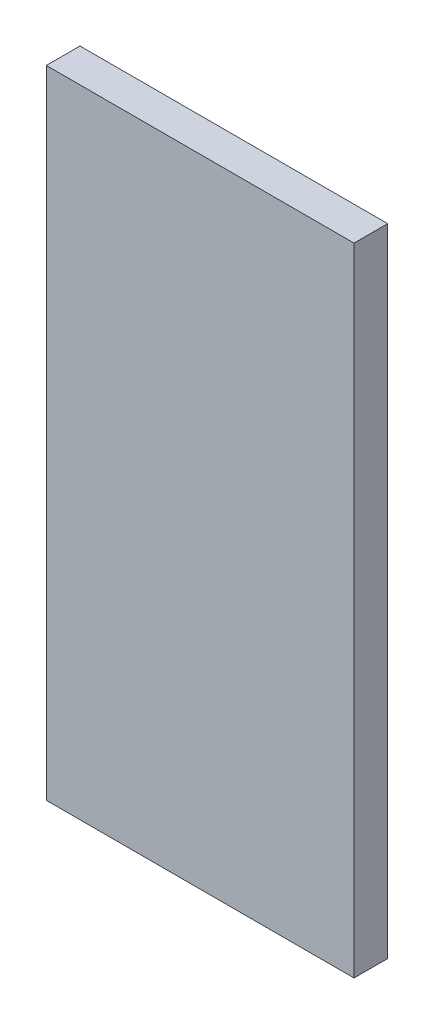
ISO-10303-21;
HEADER;
FILE_DESCRIPTION(('STEP AP214'),'2;1');
FILE_NAME('part.step','',(''),(''),'','','');
FILE_SCHEMA(('AUTOMOTIVE_DESIGN { 1 0 10303 214 1 1 1 1 }'));
ENDSEC;
DATA;
#1=APPLICATION_CONTEXT('core data for automotive mechanical design processes');
#2=APPLICATION_PROTOCOL_DEFINITION('international standard','automotive_design',2000,#1);
#3=PRODUCT_CONTEXT('',#1,'mechanical');
#4=PRODUCT('Part','Part','',(#3));
#5=PRODUCT_RELATED_PRODUCT_CATEGORY('part','',(#4));
#6=PRODUCT_DEFINITION_FORMATION('','',#4);
#7=PRODUCT_DEFINITION_CONTEXT('part definition',#1,'design');
#8=PRODUCT_DEFINITION('design','',#6,#7);
#9=PRODUCT_DEFINITION_SHAPE('','',#8);
#10=(LENGTH_UNIT() NAMED_UNIT(*) SI_UNIT(.MILLI.,.METRE.));
#11=(NAMED_UNIT(*) PLANE_ANGLE_UNIT() SI_UNIT($,.RADIAN.));
#12=(NAMED_UNIT(*) SI_UNIT($,.STERADIAN.) SOLID_ANGLE_UNIT());
#13=UNCERTAINTY_MEASURE_WITH_UNIT(LENGTH_MEASURE(1.E-05),#10,'distance_accuracy_value','');
#14=(GEOMETRIC_REPRESENTATION_CONTEXT(3) GLOBAL_UNCERTAINTY_ASSIGNED_CONTEXT((#13)) GLOBAL_UNIT_ASSIGNED_CONTEXT((#10,
#11,#12)) REPRESENTATION_CONTEXT('',''));
#15=CARTESIAN_POINT('',(0.,0.,0.));
#16=DIRECTION('',(0.,0.,1.));
#17=DIRECTION('',(1.,0.,0.));
#18=AXIS2_PLACEMENT_3D('',#15,#16,#17);
#19=CARTESIAN_POINT('',(42.0476253068543,5.94013447680411,1.7018));
#20=DIRECTION('',(-1.,0.,0.));
#21=DIRECTION('',(0.,0.,1.));
#22=AXIS2_PLACEMENT_3D('',#19,#20,#21);
#23=PLANE('',#22);
#24=DIRECTION('',(0.,1.,0.));
#25=VECTOR('',#24,1.);
#26=CARTESIAN_POINT('',(42.0476253068543,1.21466675355989,1.7018));
#27=LINE('',#26,#25);
#28=CARTESIAN_POINT('',(42.0476253068543,1.21466675355989,1.7018));
#29=VERTEX_POINT('',#28);
#30=CARTESIAN_POINT('',(42.0476253068543,5.94013447680411,1.7018));
#31=VERTEX_POINT('',#30);
#32=EDGE_CURVE('E82',#29,#31,#27,.T.);
#33=ORIENTED_EDGE('',*,*,#32,.F.);
#34=DIRECTION('',(0.,0.,1.));
#35=VECTOR('',#34,1.);
#36=CARTESIAN_POINT('',(42.0476253068543,1.21466675355989,1.7018));
#37=LINE('',#36,#35);
#38=CARTESIAN_POINT('',(42.0476253068543,1.21466675355989,1.9518));
#39=VERTEX_POINT('',#38);
#40=EDGE_CURVE('E71',#29,#39,#37,.T.);
#41=ORIENTED_EDGE('',*,*,#40,.T.);
#42=DIRECTION('',(0.,-1.,0.));
#43=VECTOR('',#42,1.);
#44=CARTESIAN_POINT('',(42.0476253068543,1.21466675355989,1.9518));
#45=LINE('',#44,#43);
#46=CARTESIAN_POINT('',(42.0476253068543,5.94013447680411,1.9518));
#47=VERTEX_POINT('',#46);
#48=EDGE_CURVE('E105',#47,#39,#45,.T.);
#49=ORIENTED_EDGE('',*,*,#48,.F.);
#50=DIRECTION('',(0.,0.,1.));
#51=VECTOR('',#50,1.);
#52=CARTESIAN_POINT('',(42.0476253068543,5.94013447680411,1.7018));
#53=LINE('',#52,#51);
#54=EDGE_CURVE('E11',#31,#47,#53,.T.);
#55=ORIENTED_EDGE('',*,*,#54,.F.);
#56=EDGE_LOOP('',(#33,#41,#49,#55));
#57=FACE_BOUND('',#56,.T.);
#58=ADVANCED_FACE('F16',(#57),#23,.T.);
#59=CARTESIAN_POINT('',(44.33225226396,5.94013447680411,1.7018));
#60=DIRECTION('',(0.,1.,0.));
#61=DIRECTION('',(1.,0.,0.));
#62=AXIS2_PLACEMENT_3D('',#59,#60,#61);
#63=PLANE('',#62);
#64=DIRECTION('',(1.,0.,0.));
#65=VECTOR('',#64,1.);
#66=CARTESIAN_POINT('',(42.0476253068543,5.94013447680411,1.7018));
#67=LINE('',#66,#65);
#68=CARTESIAN_POINT('',(44.33225226396,5.94013447680411,1.7018));
#69=VERTEX_POINT('',#68);
#70=EDGE_CURVE('E86',#31,#69,#67,.T.);
#71=ORIENTED_EDGE('',*,*,#70,.F.);
#72=ORIENTED_EDGE('',*,*,#54,.T.);
#73=DIRECTION('',(-1.,0.,0.));
#74=VECTOR('',#73,1.);
#75=CARTESIAN_POINT('',(42.0476253068543,5.94013447680411,1.9518));
#76=LINE('',#75,#74);
#77=CARTESIAN_POINT('',(44.33225226396,5.94013447680411,1.9518));
#78=VERTEX_POINT('',#77);
#79=EDGE_CURVE('E104',#78,#47,#76,.T.);
#80=ORIENTED_EDGE('',*,*,#79,.F.);
#81=DIRECTION('',(0.,0.,1.));
#82=VECTOR('',#81,1.);
#83=CARTESIAN_POINT('',(44.33225226396,5.94013447680411,1.7018));
#84=LINE('',#83,#82);
#85=EDGE_CURVE('E26',#69,#78,#84,.T.);
#86=ORIENTED_EDGE('',*,*,#85,.F.);
#87=EDGE_LOOP('',(#71,#72,#80,#86));
#88=FACE_BOUND('',#87,.T.);
#89=ADVANCED_FACE('F132',(#88),#63,.T.);
#90=CARTESIAN_POINT('',(44.33225226396,1.21466675355989,1.7018));
#91=DIRECTION('',(1.,0.,0.));
#92=DIRECTION('',(0.,1.,0.));
#93=AXIS2_PLACEMENT_3D('',#90,#91,#92);
#94=PLANE('',#93);
#95=DIRECTION('',(0.,-1.,0.));
#96=VECTOR('',#95,1.);
#97=CARTESIAN_POINT('',(44.33225226396,5.94013447680411,1.7018));
#98=LINE('',#97,#96);
#99=CARTESIAN_POINT('',(44.33225226396,1.21466675355989,1.7018));
#100=VERTEX_POINT('',#99);
#101=EDGE_CURVE('E91',#69,#100,#98,.T.);
#102=ORIENTED_EDGE('',*,*,#101,.F.);
#103=ORIENTED_EDGE('',*,*,#85,.T.);
#104=DIRECTION('',(0.,1.,0.));
#105=VECTOR('',#104,1.);
#106=CARTESIAN_POINT('',(44.33225226396,5.94013447680411,1.9518));
#107=LINE('',#106,#105);
#108=CARTESIAN_POINT('',(44.33225226396,1.21466675355989,1.9518));
#109=VERTEX_POINT('',#108);
#110=EDGE_CURVE('E101',#109,#78,#107,.T.);
#111=ORIENTED_EDGE('',*,*,#110,.F.);
#112=DIRECTION('',(0.,0.,1.));
#113=VECTOR('',#112,1.);
#114=CARTESIAN_POINT('',(44.33225226396,1.21466675355989,1.7018));
#115=LINE('',#114,#113);
#116=EDGE_CURVE('E79',#100,#109,#115,.T.);
#117=ORIENTED_EDGE('',*,*,#116,.F.);
#118=EDGE_LOOP('',(#102,#103,#111,#117));
#119=FACE_BOUND('',#118,.T.);
#120=ADVANCED_FACE('F130',(#119),#94,.T.);
#121=CARTESIAN_POINT('',(42.0476253068543,1.21466675355989,1.7018));
#122=DIRECTION('',(0.,-1.,0.));
#123=DIRECTION('',(0.,0.,-1.));
#124=AXIS2_PLACEMENT_3D('',#121,#122,#123);
#125=PLANE('',#124);
#126=DIRECTION('',(-1.,0.,0.));
#127=VECTOR('',#126,1.);
#128=CARTESIAN_POINT('',(44.33225226396,1.21466675355989,1.7018));
#129=LINE('',#128,#127);
#130=EDGE_CURVE('E75',#100,#29,#129,.T.);
#131=ORIENTED_EDGE('',*,*,#130,.F.);
#132=ORIENTED_EDGE('',*,*,#116,.T.);
#133=DIRECTION('',(1.,0.,0.));
#134=VECTOR('',#133,1.);
#135=CARTESIAN_POINT('',(44.33225226396,1.21466675355989,1.9518));
#136=LINE('',#135,#134);
#137=EDGE_CURVE('E19',#39,#109,#136,.T.);
#138=ORIENTED_EDGE('',*,*,#137,.F.);
#139=ORIENTED_EDGE('',*,*,#40,.F.);
#140=EDGE_LOOP('',(#131,#132,#138,#139));
#141=FACE_BOUND('',#140,.T.);
#142=ADVANCED_FACE('F72',(#141),#125,.T.);
#143=CARTESIAN_POINT('',(43.1899387854071,3.577400615182,1.9518));
#144=DIRECTION('',(0.,0.,1.));
#145=DIRECTION('',(1.,0.,0.));
#146=AXIS2_PLACEMENT_3D('',#143,#144,#145);
#147=PLANE('',#146);
#148=ORIENTED_EDGE('',*,*,#137,.T.);
#149=ORIENTED_EDGE('',*,*,#110,.T.);
#150=ORIENTED_EDGE('',*,*,#79,.T.);
#151=ORIENTED_EDGE('',*,*,#48,.T.);
#152=EDGE_LOOP('',(#148,#149,#150,#151));
#153=FACE_BOUND('',#152,.T.);
#154=ADVANCED_FACE('F124',(#153),#147,.T.);
#155=CARTESIAN_POINT('',(43.1899387854071,3.577400615182,1.7018));
#156=DIRECTION('',(0.,0.,1.));
#157=DIRECTION('',(1.,0.,0.));
#158=AXIS2_PLACEMENT_3D('',#155,#156,#157);
#159=PLANE('',#158);
#160=ORIENTED_EDGE('',*,*,#130,.T.);
#161=ORIENTED_EDGE('',*,*,#32,.T.);
#162=ORIENTED_EDGE('',*,*,#70,.T.);
#163=ORIENTED_EDGE('',*,*,#101,.T.);
#164=EDGE_LOOP('',(#160,#161,#162,#163));
#165=FACE_BOUND('',#164,.T.);
#166=ADVANCED_FACE('F89',(#165),#159,.F.);
#167=CLOSED_SHELL('',(#58,#89,#120,#142,#154,#166));
#168=MANIFOLD_SOLID_BREP('B1',#167);
#169=ADVANCED_BREP_SHAPE_REPRESENTATION('',(#18,#168),#14);
#170=SHAPE_DEFINITION_REPRESENTATION(#9,#169);
ENDSEC;
END-ISO-10303-21;
